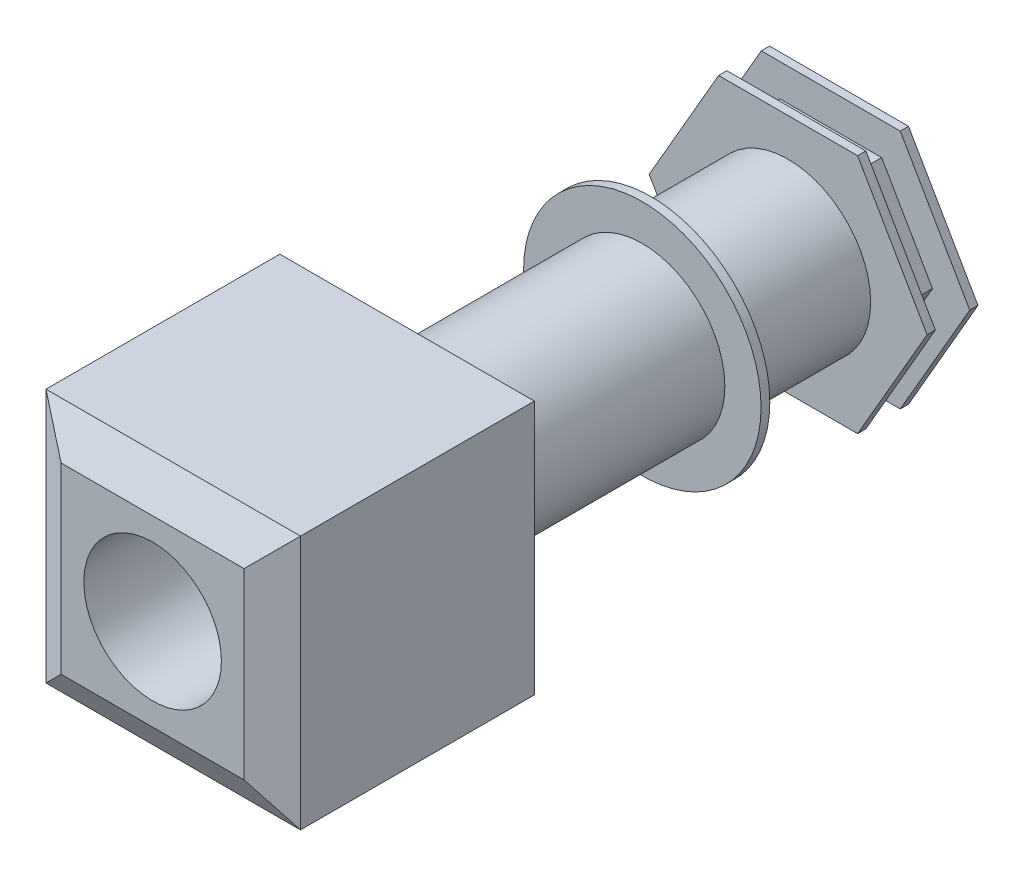
ISO-10303-21;
HEADER;
FILE_DESCRIPTION(('STEP AP214'),'2;1');
FILE_NAME('part.step','',(''),(''),'','','');
FILE_SCHEMA(('AUTOMOTIVE_DESIGN { 1 0 10303 214 1 1 1 1 }'));
ENDSEC;
DATA;
#1=APPLICATION_CONTEXT('core data for automotive mechanical design processes');
#2=APPLICATION_PROTOCOL_DEFINITION('international standard','automotive_design',2000,#1);
#3=PRODUCT_CONTEXT('',#1,'mechanical');
#4=PRODUCT('Part','Part','',(#3));
#5=PRODUCT_RELATED_PRODUCT_CATEGORY('part','',(#4));
#6=PRODUCT_DEFINITION_FORMATION('','',#4);
#7=PRODUCT_DEFINITION_CONTEXT('part definition',#1,'design');
#8=PRODUCT_DEFINITION('design','',#6,#7);
#9=PRODUCT_DEFINITION_SHAPE('','',#8);
#10=(LENGTH_UNIT() NAMED_UNIT(*) SI_UNIT(.MILLI.,.METRE.));
#11=(NAMED_UNIT(*) PLANE_ANGLE_UNIT() SI_UNIT($,.RADIAN.));
#12=(NAMED_UNIT(*) SI_UNIT($,.STERADIAN.) SOLID_ANGLE_UNIT());
#13=UNCERTAINTY_MEASURE_WITH_UNIT(LENGTH_MEASURE(1.E-05),#10,'distance_accuracy_value','');
#14=(GEOMETRIC_REPRESENTATION_CONTEXT(3) GLOBAL_UNCERTAINTY_ASSIGNED_CONTEXT((#13)) GLOBAL_UNIT_ASSIGNED_CONTEXT((#10,
#11,#12)) REPRESENTATION_CONTEXT('',''));
#15=CARTESIAN_POINT('',(0.,0.,0.));
#16=DIRECTION('',(0.,0.,1.));
#17=DIRECTION('',(1.,0.,0.));
#18=AXIS2_PLACEMENT_3D('',#15,#16,#17);
#19=CARTESIAN_POINT('',(101.036297108185,-175.,12.));
#20=DIRECTION('',(-0.866025403784439,0.5,0.));
#21=DIRECTION('',(-0.5,-0.866025403784439,0.));
#22=AXIS2_PLACEMENT_3D('',#19,#20,#21);
#23=PLANE('',#22);
#24=DIRECTION('',(0.5,0.866025403784439,0.));
#25=VECTOR('',#24,1.);
#26=CARTESIAN_POINT('',(101.036297108185,-175.,0.));
#27=LINE('',#26,#25);
#28=CARTESIAN_POINT('',(101.036297108185,-175.,0.));
#29=VERTEX_POINT('',#28);
#30=CARTESIAN_POINT('',(202.072594216369,0.,0.));
#31=VERTEX_POINT('',#30);
#32=EDGE_CURVE('E409',#29,#31,#27,.T.);
#33=ORIENTED_EDGE('',*,*,#32,.T.);
#34=DIRECTION('',(0.,0.,-1.));
#35=VECTOR('',#34,1.);
#36=CARTESIAN_POINT('',(202.072594216369,0.,12.));
#37=LINE('',#36,#35);
#38=CARTESIAN_POINT('',(202.072594216369,0.,12.));
#39=VERTEX_POINT('',#38);
#40=EDGE_CURVE('E275',#39,#31,#37,.T.);
#41=ORIENTED_EDGE('',*,*,#40,.F.);
#42=DIRECTION('',(0.5,0.866025403784439,0.));
#43=VECTOR('',#42,1.);
#44=CARTESIAN_POINT('',(101.036297108185,-175.,12.));
#45=LINE('',#44,#43);
#46=CARTESIAN_POINT('',(101.036297108185,-175.,12.));
#47=VERTEX_POINT('',#46);
#48=EDGE_CURVE('E410',#47,#39,#45,.T.);
#49=ORIENTED_EDGE('',*,*,#48,.F.);
#50=DIRECTION('',(0.,0.,-1.));
#51=VECTOR('',#50,1.);
#52=CARTESIAN_POINT('',(101.036297108185,-175.,12.));
#53=LINE('',#52,#51);
#54=EDGE_CURVE('E430',#47,#29,#53,.T.);
#55=ORIENTED_EDGE('',*,*,#54,.T.);
#56=EDGE_LOOP('',(#33,#41,#49,#55));
#57=FACE_BOUND('',#56,.T.);
#58=ADVANCED_FACE('F41',(#57),#23,.F.);
#59=CARTESIAN_POINT('',(202.072594216369,0.,12.));
#60=DIRECTION('',(-0.866025403784439,-0.5,0.));
#61=DIRECTION('',(0.5,-0.866025403784439,0.));
#62=AXIS2_PLACEMENT_3D('',#59,#60,#61);
#63=PLANE('',#62);
#64=DIRECTION('',(-0.5,0.866025403784439,0.));
#65=VECTOR('',#64,1.);
#66=CARTESIAN_POINT('',(202.072594216369,0.,0.));
#67=LINE('',#66,#65);
#68=CARTESIAN_POINT('',(101.036297108185,175.,0.));
#69=VERTEX_POINT('',#68);
#70=EDGE_CURVE('E434',#31,#69,#67,.T.);
#71=ORIENTED_EDGE('',*,*,#70,.T.);
#72=DIRECTION('',(0.,0.,-1.));
#73=VECTOR('',#72,1.);
#74=CARTESIAN_POINT('',(101.036297108185,175.,12.));
#75=LINE('',#74,#73);
#76=CARTESIAN_POINT('',(101.036297108185,175.,12.));
#77=VERTEX_POINT('',#76);
#78=EDGE_CURVE('E463',#77,#69,#75,.T.);
#79=ORIENTED_EDGE('',*,*,#78,.F.);
#80=DIRECTION('',(-0.5,0.866025403784439,0.));
#81=VECTOR('',#80,1.);
#82=CARTESIAN_POINT('',(202.072594216369,0.,12.));
#83=LINE('',#82,#81);
#84=EDGE_CURVE('E414',#39,#77,#83,.T.);
#85=ORIENTED_EDGE('',*,*,#84,.F.);
#86=ORIENTED_EDGE('',*,*,#40,.T.);
#87=EDGE_LOOP('',(#71,#79,#85,#86));
#88=FACE_BOUND('',#87,.T.);
#89=ADVANCED_FACE('F540',(#88),#63,.F.);
#90=CARTESIAN_POINT('',(101.036297108185,175.,12.));
#91=DIRECTION('',(0.,-1.,0.));
#92=DIRECTION('',(1.,0.,0.));
#93=AXIS2_PLACEMENT_3D('',#90,#91,#92);
#94=PLANE('',#93);
#95=DIRECTION('',(-1.,0.,0.));
#96=VECTOR('',#95,1.);
#97=CARTESIAN_POINT('',(101.036297108185,175.,0.));
#98=LINE('',#97,#96);
#99=CARTESIAN_POINT('',(-101.036297108185,175.,0.));
#100=VERTEX_POINT('',#99);
#101=EDGE_CURVE('E437',#69,#100,#98,.T.);
#102=ORIENTED_EDGE('',*,*,#101,.T.);
#103=DIRECTION('',(0.,0.,-1.));
#104=VECTOR('',#103,1.);
#105=CARTESIAN_POINT('',(-101.036297108185,175.,12.));
#106=LINE('',#105,#104);
#107=CARTESIAN_POINT('',(-101.036297108185,175.,12.));
#108=VERTEX_POINT('',#107);
#109=EDGE_CURVE('E459',#108,#100,#106,.T.);
#110=ORIENTED_EDGE('',*,*,#109,.F.);
#111=DIRECTION('',(-1.,0.,0.));
#112=VECTOR('',#111,1.);
#113=CARTESIAN_POINT('',(101.036297108185,175.,12.));
#114=LINE('',#113,#112);
#115=EDGE_CURVE('E418',#77,#108,#114,.T.);
#116=ORIENTED_EDGE('',*,*,#115,.F.);
#117=ORIENTED_EDGE('',*,*,#78,.T.);
#118=EDGE_LOOP('',(#102,#110,#116,#117));
#119=FACE_BOUND('',#118,.T.);
#120=ADVANCED_FACE('F546',(#119),#94,.F.);
#121=CARTESIAN_POINT('',(-101.036297108185,175.,12.));
#122=DIRECTION('',(0.866025403784439,-0.5,0.));
#123=DIRECTION('',(0.5,0.866025403784439,0.));
#124=AXIS2_PLACEMENT_3D('',#121,#122,#123);
#125=PLANE('',#124);
#126=DIRECTION('',(-0.5,-0.866025403784439,0.));
#127=VECTOR('',#126,1.);
#128=CARTESIAN_POINT('',(-101.036297108185,175.,0.));
#129=LINE('',#128,#127);
#130=CARTESIAN_POINT('',(-202.072594216369,0.,0.));
#131=VERTEX_POINT('',#130);
#132=EDGE_CURVE('E440',#100,#131,#129,.T.);
#133=ORIENTED_EDGE('',*,*,#132,.T.);
#134=DIRECTION('',(0.,0.,-1.));
#135=VECTOR('',#134,1.);
#136=CARTESIAN_POINT('',(-202.072594216369,0.,12.));
#137=LINE('',#136,#135);
#138=CARTESIAN_POINT('',(-202.072594216369,0.,12.));
#139=VERTEX_POINT('',#138);
#140=EDGE_CURVE('E455',#139,#131,#137,.T.);
#141=ORIENTED_EDGE('',*,*,#140,.F.);
#142=DIRECTION('',(-0.5,-0.866025403784439,0.));
#143=VECTOR('',#142,1.);
#144=CARTESIAN_POINT('',(-101.036297108185,175.,12.));
#145=LINE('',#144,#143);
#146=EDGE_CURVE('E421',#108,#139,#145,.T.);
#147=ORIENTED_EDGE('',*,*,#146,.F.);
#148=ORIENTED_EDGE('',*,*,#109,.T.);
#149=EDGE_LOOP('',(#133,#141,#147,#148));
#150=FACE_BOUND('',#149,.T.);
#151=ADVANCED_FACE('F700',(#150),#125,.F.);
#152=CARTESIAN_POINT('',(-202.072594216369,0.,12.));
#153=DIRECTION('',(0.866025403784439,0.5,0.));
#154=DIRECTION('',(-0.5,0.866025403784439,0.));
#155=AXIS2_PLACEMENT_3D('',#152,#153,#154);
#156=PLANE('',#155);
#157=DIRECTION('',(0.5,-0.866025403784439,0.));
#158=VECTOR('',#157,1.);
#159=CARTESIAN_POINT('',(-202.072594216369,0.,0.));
#160=LINE('',#159,#158);
#161=CARTESIAN_POINT('',(-101.036297108185,-175.,0.));
#162=VERTEX_POINT('',#161);
#163=EDGE_CURVE('E443',#131,#162,#160,.T.);
#164=ORIENTED_EDGE('',*,*,#163,.T.);
#165=DIRECTION('',(0.,0.,-1.));
#166=VECTOR('',#165,1.);
#167=CARTESIAN_POINT('',(-101.036297108185,-175.,12.));
#168=LINE('',#167,#166);
#169=CARTESIAN_POINT('',(-101.036297108185,-175.,12.));
#170=VERTEX_POINT('',#169);
#171=EDGE_CURVE('E451',#170,#162,#168,.T.);
#172=ORIENTED_EDGE('',*,*,#171,.F.);
#173=DIRECTION('',(0.5,-0.866025403784439,0.));
#174=VECTOR('',#173,1.);
#175=CARTESIAN_POINT('',(-202.072594216369,0.,12.));
#176=LINE('',#175,#174);
#177=EDGE_CURVE('E424',#139,#170,#176,.T.);
#178=ORIENTED_EDGE('',*,*,#177,.F.);
#179=ORIENTED_EDGE('',*,*,#140,.T.);
#180=EDGE_LOOP('',(#164,#172,#178,#179));
#181=FACE_BOUND('',#180,.T.);
#182=ADVANCED_FACE('F696',(#181),#156,.F.);
#183=CARTESIAN_POINT('',(-101.036297108185,-175.,12.));
#184=DIRECTION('',(0.,1.,0.));
#185=DIRECTION('',(0.,0.,1.));
#186=AXIS2_PLACEMENT_3D('',#183,#184,#185);
#187=PLANE('',#186);
#188=DIRECTION('',(1.,0.,0.));
#189=VECTOR('',#188,1.);
#190=CARTESIAN_POINT('',(-101.036297108185,-175.,0.));
#191=LINE('',#190,#189);
#192=EDGE_CURVE('E415',#162,#29,#191,.T.);
#193=ORIENTED_EDGE('',*,*,#192,.T.);
#194=ORIENTED_EDGE('',*,*,#54,.F.);
#195=DIRECTION('',(1.,0.,0.));
#196=VECTOR('',#195,1.);
#197=CARTESIAN_POINT('',(-101.036297108185,-175.,12.));
#198=LINE('',#197,#196);
#199=EDGE_CURVE('E427',#170,#47,#198,.T.);
#200=ORIENTED_EDGE('',*,*,#199,.F.);
#201=ORIENTED_EDGE('',*,*,#171,.T.);
#202=EDGE_LOOP('',(#193,#194,#200,#201));
#203=FACE_BOUND('',#202,.T.);
#204=ADVANCED_FACE('F689',(#203),#187,.F.);
#205=CARTESIAN_POINT('',(0.,0.,12.));
#206=DIRECTION('',(0.,0.,1.));
#207=DIRECTION('',(1.,0.,0.));
#208=AXIS2_PLACEMENT_3D('',#205,#206,#207);
#209=PLANE('',#208);
#210=DIRECTION('',(0.499999999999995,0.866025403784441,0.));
#211=VECTOR('',#210,1.);
#212=CARTESIAN_POINT('',(73.9437494106932,-128.074330881458,12.));
#213=LINE('',#212,#211);
#214=CARTESIAN_POINT('',(73.9437494106932,-128.074330881458,12.));
#215=VERTEX_POINT('',#214);
#216=CARTESIAN_POINT('',(147.887498821383,0.,12.));
#217=VERTEX_POINT('',#216);
#218=EDGE_CURVE('E337',#215,#217,#213,.T.);
#219=ORIENTED_EDGE('',*,*,#218,.F.);
#220=DIRECTION('',(1.,0.,0.));
#221=VECTOR('',#220,1.);
#222=CARTESIAN_POINT('',(-73.9437494106905,-128.07433088146,12.));
#223=LINE('',#222,#221);
#224=CARTESIAN_POINT('',(-73.9437494106905,-128.07433088146,12.));
#225=VERTEX_POINT('',#224);
#226=EDGE_CURVE('E343',#225,#215,#223,.T.);
#227=ORIENTED_EDGE('',*,*,#226,.F.);
#228=DIRECTION('',(0.500000000000007,-0.866025403784435,0.));
#229=VECTOR('',#228,1.);
#230=CARTESIAN_POINT('',(-147.887498821383,-1.03269288476609E-12,12.));
#231=LINE('',#230,#229);
#232=CARTESIAN_POINT('',(-147.887498821383,-1.03269288476609E-12,12.));
#233=VERTEX_POINT('',#232);
#234=EDGE_CURVE('E379',#233,#225,#231,.T.);
#235=ORIENTED_EDGE('',*,*,#234,.F.);
#236=DIRECTION('',(-0.499999999999995,-0.866025403784442,0.));
#237=VECTOR('',#236,1.);
#238=CARTESIAN_POINT('',(-73.9437494106923,128.074330881459,12.));
#239=LINE('',#238,#237);
#240=CARTESIAN_POINT('',(-73.9437494106923,128.074330881459,12.));
#241=VERTEX_POINT('',#240);
#242=EDGE_CURVE('E375',#241,#233,#239,.T.);
#243=ORIENTED_EDGE('',*,*,#242,.F.);
#244=DIRECTION('',(-1.,0.,0.));
#245=VECTOR('',#244,1.);
#246=CARTESIAN_POINT('',(73.9437494106914,128.074330881459,12.));
#247=LINE('',#246,#245);
#248=CARTESIAN_POINT('',(73.9437494106914,128.074330881459,12.));
#249=VERTEX_POINT('',#248);
#250=EDGE_CURVE('E371',#249,#241,#247,.T.);
#251=ORIENTED_EDGE('',*,*,#250,.F.);
#252=DIRECTION('',(-0.500000000000001,0.866025403784438,0.));
#253=VECTOR('',#252,1.);
#254=CARTESIAN_POINT('',(147.887498821383,0.,12.));
#255=LINE('',#254,#253);
#256=EDGE_CURVE('E367',#217,#249,#255,.T.);
#257=ORIENTED_EDGE('',*,*,#256,.F.);
#258=EDGE_LOOP('',(#219,#227,#235,#243,#251,#257));
#259=FACE_BOUND('',#258,.T.);
#260=ORIENTED_EDGE('',*,*,#48,.T.);
#261=ORIENTED_EDGE('',*,*,#84,.T.);
#262=ORIENTED_EDGE('',*,*,#115,.T.);
#263=ORIENTED_EDGE('',*,*,#146,.T.);
#264=ORIENTED_EDGE('',*,*,#177,.T.);
#265=ORIENTED_EDGE('',*,*,#199,.T.);
#266=EDGE_LOOP('',(#260,#261,#262,#263,#264,#265));
#267=FACE_BOUND('',#266,.T.);
#268=ADVANCED_FACE('F686',(#259,#267),#209,.T.);
#269=CARTESIAN_POINT('',(0.,0.,0.));
#270=DIRECTION('',(0.,0.,1.));
#271=DIRECTION('',(1.,0.,0.));
#272=AXIS2_PLACEMENT_3D('',#269,#270,#271);
#273=PLANE('',#272);
#274=ORIENTED_EDGE('',*,*,#32,.F.);
#275=ORIENTED_EDGE('',*,*,#192,.F.);
#276=ORIENTED_EDGE('',*,*,#163,.F.);
#277=ORIENTED_EDGE('',*,*,#132,.F.);
#278=ORIENTED_EDGE('',*,*,#101,.F.);
#279=ORIENTED_EDGE('',*,*,#70,.F.);
#280=EDGE_LOOP('',(#274,#275,#276,#277,#278,#279));
#281=FACE_BOUND('',#280,.T.);
#282=ADVANCED_FACE('F684',(#281),#273,.F.);
#283=CARTESIAN_POINT('',(73.9437494106932,-128.074330881458,62.));
#284=DIRECTION('',(-0.866025403784442,0.499999999999995,0.));
#285=DIRECTION('',(-0.499999999999995,-0.866025403784442,0.));
#286=AXIS2_PLACEMENT_3D('',#283,#284,#285);
#287=PLANE('',#286);
#288=ORIENTED_EDGE('',*,*,#218,.T.);
#289=DIRECTION('',(0.,0.,-1.));
#290=VECTOR('',#289,1.);
#291=CARTESIAN_POINT('',(147.887498821383,0.,62.));
#292=LINE('',#291,#290);
#293=CARTESIAN_POINT('',(147.887498821383,0.,62.));
#294=VERTEX_POINT('',#293);
#295=EDGE_CURVE('E405',#294,#217,#292,.T.);
#296=ORIENTED_EDGE('',*,*,#295,.F.);
#297=DIRECTION('',(0.499999999999995,0.866025403784441,0.));
#298=VECTOR('',#297,1.);
#299=CARTESIAN_POINT('',(73.9437494106932,-128.074330881458,62.));
#300=LINE('',#299,#298);
#301=CARTESIAN_POINT('',(73.9437494106932,-128.074330881458,62.));
#302=VERTEX_POINT('',#301);
#303=EDGE_CURVE('E338',#302,#294,#300,.T.);
#304=ORIENTED_EDGE('',*,*,#303,.F.);
#305=DIRECTION('',(0.,0.,-1.));
#306=VECTOR('',#305,1.);
#307=CARTESIAN_POINT('',(73.9437494106932,-128.074330881458,62.));
#308=LINE('',#307,#306);
#309=EDGE_CURVE('E363',#302,#215,#308,.T.);
#310=ORIENTED_EDGE('',*,*,#309,.T.);
#311=EDGE_LOOP('',(#288,#296,#304,#310));
#312=FACE_BOUND('',#311,.T.);
#313=ADVANCED_FACE('F680',(#312),#287,.F.);
#314=CARTESIAN_POINT('',(147.887498821383,0.,62.));
#315=DIRECTION('',(-0.866025403784438,-0.500000000000001,0.));
#316=DIRECTION('',(0.500000000000001,-0.866025403784438,0.));
#317=AXIS2_PLACEMENT_3D('',#314,#315,#316);
#318=PLANE('',#317);
#319=ORIENTED_EDGE('',*,*,#256,.T.);
#320=DIRECTION('',(0.,0.,-1.));
#321=VECTOR('',#320,1.);
#322=CARTESIAN_POINT('',(73.9437494106914,128.074330881459,62.));
#323=LINE('',#322,#321);
#324=CARTESIAN_POINT('',(73.9437494106914,128.074330881459,62.));
#325=VERTEX_POINT('',#324);
#326=EDGE_CURVE('E401',#325,#249,#323,.T.);
#327=ORIENTED_EDGE('',*,*,#326,.F.);
#328=DIRECTION('',(-0.500000000000001,0.866025403784438,0.));
#329=VECTOR('',#328,1.);
#330=CARTESIAN_POINT('',(147.887498821383,0.,62.));
#331=LINE('',#330,#329);
#332=EDGE_CURVE('E342',#294,#325,#331,.T.);
#333=ORIENTED_EDGE('',*,*,#332,.F.);
#334=ORIENTED_EDGE('',*,*,#295,.T.);
#335=EDGE_LOOP('',(#319,#327,#333,#334));
#336=FACE_BOUND('',#335,.T.);
#337=ADVANCED_FACE('F676',(#336),#318,.F.);
#338=CARTESIAN_POINT('',(73.9437494106914,128.074330881459,62.));
#339=DIRECTION('',(0.,-1.,0.));
#340=DIRECTION('',(1.,0.,0.));
#341=AXIS2_PLACEMENT_3D('',#338,#339,#340);
#342=PLANE('',#341);
#343=ORIENTED_EDGE('',*,*,#250,.T.);
#344=DIRECTION('',(0.,0.,-1.));
#345=VECTOR('',#344,1.);
#346=CARTESIAN_POINT('',(-73.9437494106923,128.074330881459,62.));
#347=LINE('',#346,#345);
#348=CARTESIAN_POINT('',(-73.9437494106923,128.074330881459,62.));
#349=VERTEX_POINT('',#348);
#350=EDGE_CURVE('E397',#349,#241,#347,.T.);
#351=ORIENTED_EDGE('',*,*,#350,.F.);
#352=DIRECTION('',(-1.,0.,0.));
#353=VECTOR('',#352,1.);
#354=CARTESIAN_POINT('',(73.9437494106914,128.074330881459,62.));
#355=LINE('',#354,#353);
#356=EDGE_CURVE('E347',#325,#349,#355,.T.);
#357=ORIENTED_EDGE('',*,*,#356,.F.);
#358=ORIENTED_EDGE('',*,*,#326,.T.);
#359=EDGE_LOOP('',(#343,#351,#357,#358));
#360=FACE_BOUND('',#359,.T.);
#361=ADVANCED_FACE('F672',(#360),#342,.F.);
#362=CARTESIAN_POINT('',(-73.9437494106923,128.074330881459,62.));
#363=DIRECTION('',(0.866025403784442,-0.499999999999995,0.));
#364=DIRECTION('',(0.499999999999995,0.866025403784442,0.));
#365=AXIS2_PLACEMENT_3D('',#362,#363,#364);
#366=PLANE('',#365);
#367=ORIENTED_EDGE('',*,*,#242,.T.);
#368=DIRECTION('',(0.,0.,-1.));
#369=VECTOR('',#368,1.);
#370=CARTESIAN_POINT('',(-147.887498821383,-1.03269288476609E-12,62.));
#371=LINE('',#370,#369);
#372=CARTESIAN_POINT('',(-147.887498821383,-1.03269288476609E-12,62.));
#373=VERTEX_POINT('',#372);
#374=EDGE_CURVE('E393',#373,#233,#371,.T.);
#375=ORIENTED_EDGE('',*,*,#374,.F.);
#376=DIRECTION('',(-0.499999999999995,-0.866025403784442,0.));
#377=VECTOR('',#376,1.);
#378=CARTESIAN_POINT('',(-73.9437494106923,128.074330881459,62.));
#379=LINE('',#378,#377);
#380=EDGE_CURVE('E351',#349,#373,#379,.T.);
#381=ORIENTED_EDGE('',*,*,#380,.F.);
#382=ORIENTED_EDGE('',*,*,#350,.T.);
#383=EDGE_LOOP('',(#367,#375,#381,#382));
#384=FACE_BOUND('',#383,.T.);
#385=ADVANCED_FACE('F668',(#384),#366,.F.);
#386=CARTESIAN_POINT('',(-147.887498821383,-1.03269288476609E-12,62.));
#387=DIRECTION('',(0.866025403784435,0.500000000000007,0.));
#388=DIRECTION('',(-0.500000000000007,0.866025403784435,0.));
#389=AXIS2_PLACEMENT_3D('',#386,#387,#388);
#390=PLANE('',#389);
#391=ORIENTED_EDGE('',*,*,#234,.T.);
#392=DIRECTION('',(0.,0.,-1.));
#393=VECTOR('',#392,1.);
#394=CARTESIAN_POINT('',(-73.9437494106905,-128.07433088146,62.));
#395=LINE('',#394,#393);
#396=CARTESIAN_POINT('',(-73.9437494106905,-128.07433088146,62.));
#397=VERTEX_POINT('',#396);
#398=EDGE_CURVE('E389',#397,#225,#395,.T.);
#399=ORIENTED_EDGE('',*,*,#398,.F.);
#400=DIRECTION('',(0.500000000000007,-0.866025403784435,0.));
#401=VECTOR('',#400,1.);
#402=CARTESIAN_POINT('',(-147.887498821383,-1.03269288476609E-12,62.));
#403=LINE('',#402,#401);
#404=EDGE_CURVE('E355',#373,#397,#403,.T.);
#405=ORIENTED_EDGE('',*,*,#404,.F.);
#406=ORIENTED_EDGE('',*,*,#374,.T.);
#407=EDGE_LOOP('',(#391,#399,#405,#406));
#408=FACE_BOUND('',#407,.T.);
#409=ADVANCED_FACE('F664',(#408),#390,.F.);
#410=CARTESIAN_POINT('',(-73.9437494106905,-128.07433088146,62.));
#411=DIRECTION('',(0.,1.,0.));
#412=DIRECTION('',(-1.,0.,0.));
#413=AXIS2_PLACEMENT_3D('',#410,#411,#412);
#414=PLANE('',#413);
#415=ORIENTED_EDGE('',*,*,#226,.T.);
#416=ORIENTED_EDGE('',*,*,#309,.F.);
#417=DIRECTION('',(1.,0.,0.));
#418=VECTOR('',#417,1.);
#419=CARTESIAN_POINT('',(-73.9437494106905,-128.07433088146,62.));
#420=LINE('',#419,#418);
#421=EDGE_CURVE('E359',#397,#302,#420,.T.);
#422=ORIENTED_EDGE('',*,*,#421,.F.);
#423=ORIENTED_EDGE('',*,*,#398,.T.);
#424=EDGE_LOOP('',(#415,#416,#422,#423));
#425=FACE_BOUND('',#424,.T.);
#426=ADVANCED_FACE('F638',(#425),#414,.F.);
#427=CARTESIAN_POINT('',(0.,0.,62.));
#428=DIRECTION('',(0.,0.,1.));
#429=DIRECTION('',(1.,0.,0.));
#430=AXIS2_PLACEMENT_3D('',#427,#428,#429);
#431=PLANE('',#430);
#432=DIRECTION('',(0.499999999999995,0.866025403784442,0.));
#433=VECTOR('',#432,1.);
#434=CARTESIAN_POINT('',(101.036297108187,-174.999999999999,62.));
#435=LINE('',#434,#433);
#436=CARTESIAN_POINT('',(101.036297108187,-174.999999999999,62.));
#437=VERTEX_POINT('',#436);
#438=CARTESIAN_POINT('',(202.072594216369,0.,62.));
#439=VERTEX_POINT('',#438);
#440=EDGE_CURVE('E269',#437,#439,#435,.T.);
#441=ORIENTED_EDGE('',*,*,#440,.F.);
#442=DIRECTION('',(1.,0.,0.));
#443=VECTOR('',#442,1.);
#444=CARTESIAN_POINT('',(-101.036297108183,-175.000000000001,62.));
#445=LINE('',#444,#443);
#446=CARTESIAN_POINT('',(-101.036297108183,-175.000000000001,62.));
#447=VERTEX_POINT('',#446);
#448=EDGE_CURVE('E281',#447,#437,#445,.T.);
#449=ORIENTED_EDGE('',*,*,#448,.F.);
#450=DIRECTION('',(0.500000000000007,-0.866025403784435,0.));
#451=VECTOR('',#450,1.);
#452=CARTESIAN_POINT('',(-202.072594216369,-1.41106538359615E-12,62.));
#453=LINE('',#452,#451);
#454=CARTESIAN_POINT('',(-202.072594216369,-1.41106538359615E-12,62.));
#455=VERTEX_POINT('',#454);
#456=EDGE_CURVE('E309',#455,#447,#453,.T.);
#457=ORIENTED_EDGE('',*,*,#456,.F.);
#458=DIRECTION('',(-0.499999999999995,-0.866025403784442,0.));
#459=VECTOR('',#458,1.);
#460=CARTESIAN_POINT('',(-101.036297108185,175.,62.));
#461=LINE('',#460,#459);
#462=CARTESIAN_POINT('',(-101.036297108185,175.,62.));
#463=VERTEX_POINT('',#462);
#464=EDGE_CURVE('E306',#463,#455,#461,.T.);
#465=ORIENTED_EDGE('',*,*,#464,.F.);
#466=DIRECTION('',(-1.,0.,0.));
#467=VECTOR('',#466,1.);
#468=CARTESIAN_POINT('',(101.036297108184,175.,62.));
#469=LINE('',#468,#467);
#470=CARTESIAN_POINT('',(101.036297108184,175.,62.));
#471=VERTEX_POINT('',#470);
#472=EDGE_CURVE('E303',#471,#463,#469,.T.);
#473=ORIENTED_EDGE('',*,*,#472,.F.);
#474=DIRECTION('',(-0.500000000000001,0.866025403784438,0.));
#475=VECTOR('',#474,1.);
#476=CARTESIAN_POINT('',(202.072594216369,0.,62.));
#477=LINE('',#476,#475);
#478=EDGE_CURVE('E300',#439,#471,#477,.T.);
#479=ORIENTED_EDGE('',*,*,#478,.F.);
#480=EDGE_LOOP('',(#441,#449,#457,#465,#473,#479));
#481=FACE_BOUND('',#480,.T.);
#482=ORIENTED_EDGE('',*,*,#421,.T.);
#483=ORIENTED_EDGE('',*,*,#303,.T.);
#484=ORIENTED_EDGE('',*,*,#332,.T.);
#485=ORIENTED_EDGE('',*,*,#356,.T.);
#486=ORIENTED_EDGE('',*,*,#380,.T.);
#487=ORIENTED_EDGE('',*,*,#404,.T.);
#488=EDGE_LOOP('',(#482,#483,#484,#485,#486,#487));
#489=FACE_BOUND('',#488,.T.);
#490=ADVANCED_FACE('F634',(#481,#489),#431,.F.);
#491=CARTESIAN_POINT('',(101.036297108187,-174.999999999999,74.));
#492=DIRECTION('',(-0.866025403784441,0.499999999999995,0.));
#493=DIRECTION('',(-0.499999999999995,-0.866025403784442,0.));
#494=AXIS2_PLACEMENT_3D('',#491,#492,#493);
#495=PLANE('',#494);
#496=ORIENTED_EDGE('',*,*,#440,.T.);
#497=DIRECTION('',(0.,0.,-1.));
#498=VECTOR('',#497,1.);
#499=CARTESIAN_POINT('',(202.072594216369,0.,74.));
#500=LINE('',#499,#498);
#501=CARTESIAN_POINT('',(202.072594216369,0.,74.));
#502=VERTEX_POINT('',#501);
#503=EDGE_CURVE('E333',#502,#439,#500,.T.);
#504=ORIENTED_EDGE('',*,*,#503,.F.);
#505=DIRECTION('',(0.499999999999995,0.866025403784442,0.));
#506=VECTOR('',#505,1.);
#507=CARTESIAN_POINT('',(101.036297108187,-174.999999999999,74.));
#508=LINE('',#507,#506);
#509=CARTESIAN_POINT('',(101.036297108187,-174.999999999999,74.));
#510=VERTEX_POINT('',#509);
#511=EDGE_CURVE('E276',#510,#502,#508,.T.);
#512=ORIENTED_EDGE('',*,*,#511,.F.);
#513=DIRECTION('',(0.,0.,-1.));
#514=VECTOR('',#513,1.);
#515=CARTESIAN_POINT('',(101.036297108187,-174.999999999999,74.));
#516=LINE('',#515,#514);
#517=EDGE_CURVE('E296',#510,#437,#516,.T.);
#518=ORIENTED_EDGE('',*,*,#517,.T.);
#519=EDGE_LOOP('',(#496,#504,#512,#518));
#520=FACE_BOUND('',#519,.T.);
#521=ADVANCED_FACE('F637',(#520),#495,.F.);
#522=CARTESIAN_POINT('',(202.072594216369,0.,74.));
#523=DIRECTION('',(-0.866025403784438,-0.500000000000001,0.));
#524=DIRECTION('',(0.500000000000001,-0.866025403784438,0.));
#525=AXIS2_PLACEMENT_3D('',#522,#523,#524);
#526=PLANE('',#525);
#527=ORIENTED_EDGE('',*,*,#478,.T.);
#528=DIRECTION('',(0.,0.,-1.));
#529=VECTOR('',#528,1.);
#530=CARTESIAN_POINT('',(101.036297108184,175.,74.));
#531=LINE('',#530,#529);
#532=CARTESIAN_POINT('',(101.036297108184,175.,74.));
#533=VERTEX_POINT('',#532);
#534=EDGE_CURVE('E329',#533,#471,#531,.T.);
#535=ORIENTED_EDGE('',*,*,#534,.F.);
#536=DIRECTION('',(-0.500000000000001,0.866025403784438,0.));
#537=VECTOR('',#536,1.);
#538=CARTESIAN_POINT('',(202.072594216369,0.,74.));
#539=LINE('',#538,#537);
#540=EDGE_CURVE('E280',#502,#533,#539,.T.);
#541=ORIENTED_EDGE('',*,*,#540,.F.);
#542=ORIENTED_EDGE('',*,*,#503,.T.);
#543=EDGE_LOOP('',(#527,#535,#541,#542));
#544=FACE_BOUND('',#543,.T.);
#545=ADVANCED_FACE('F654',(#544),#526,.F.);
#546=CARTESIAN_POINT('',(101.036297108184,175.,74.));
#547=DIRECTION('',(0.,-1.,0.));
#548=DIRECTION('',(1.,0.,0.));
#549=AXIS2_PLACEMENT_3D('',#546,#547,#548);
#550=PLANE('',#549);
#551=ORIENTED_EDGE('',*,*,#472,.T.);
#552=DIRECTION('',(0.,0.,-1.));
#553=VECTOR('',#552,1.);
#554=CARTESIAN_POINT('',(-101.036297108185,175.,74.));
#555=LINE('',#554,#553);
#556=CARTESIAN_POINT('',(-101.036297108185,175.,74.));
#557=VERTEX_POINT('',#556);
#558=EDGE_CURVE('E325',#557,#463,#555,.T.);
#559=ORIENTED_EDGE('',*,*,#558,.F.);
#560=DIRECTION('',(-1.,0.,0.));
#561=VECTOR('',#560,1.);
#562=CARTESIAN_POINT('',(101.036297108184,175.,74.));
#563=LINE('',#562,#561);
#564=EDGE_CURVE('E284',#533,#557,#563,.T.);
#565=ORIENTED_EDGE('',*,*,#564,.F.);
#566=ORIENTED_EDGE('',*,*,#534,.T.);
#567=EDGE_LOOP('',(#551,#559,#565,#566));
#568=FACE_BOUND('',#567,.T.);
#569=ADVANCED_FACE('F650',(#568),#550,.F.);
#570=CARTESIAN_POINT('',(-101.036297108185,175.,74.));
#571=DIRECTION('',(0.866025403784441,-0.499999999999995,0.));
#572=DIRECTION('',(0.499999999999995,0.866025403784442,0.));
#573=AXIS2_PLACEMENT_3D('',#570,#571,#572);
#574=PLANE('',#573);
#575=ORIENTED_EDGE('',*,*,#464,.T.);
#576=DIRECTION('',(0.,0.,-1.));
#577=VECTOR('',#576,1.);
#578=CARTESIAN_POINT('',(-202.072594216369,-1.41106538359615E-12,74.));
#579=LINE('',#578,#577);
#580=CARTESIAN_POINT('',(-202.072594216369,-1.41106538359615E-12,74.));
#581=VERTEX_POINT('',#580);
#582=EDGE_CURVE('E321',#581,#455,#579,.T.);
#583=ORIENTED_EDGE('',*,*,#582,.F.);
#584=DIRECTION('',(-0.499999999999995,-0.866025403784442,0.));
#585=VECTOR('',#584,1.);
#586=CARTESIAN_POINT('',(-101.036297108185,175.,74.));
#587=LINE('',#586,#585);
#588=EDGE_CURVE('E287',#557,#581,#587,.T.);
#589=ORIENTED_EDGE('',*,*,#588,.F.);
#590=ORIENTED_EDGE('',*,*,#558,.T.);
#591=EDGE_LOOP('',(#575,#583,#589,#590));
#592=FACE_BOUND('',#591,.T.);
#593=ADVANCED_FACE('F646',(#592),#574,.F.);
#594=CARTESIAN_POINT('',(-202.072594216369,-1.41106538359615E-12,74.));
#595=DIRECTION('',(0.866025403784435,0.500000000000007,0.));
#596=DIRECTION('',(-0.500000000000007,0.866025403784434,0.));
#597=AXIS2_PLACEMENT_3D('',#594,#595,#596);
#598=PLANE('',#597);
#599=ORIENTED_EDGE('',*,*,#456,.T.);
#600=DIRECTION('',(0.,0.,-1.));
#601=VECTOR('',#600,1.);
#602=CARTESIAN_POINT('',(-101.036297108183,-175.000000000001,74.));
#603=LINE('',#602,#601);
#604=CARTESIAN_POINT('',(-101.036297108183,-175.000000000001,74.));
#605=VERTEX_POINT('',#604);
#606=EDGE_CURVE('E317',#605,#447,#603,.T.);
#607=ORIENTED_EDGE('',*,*,#606,.F.);
#608=DIRECTION('',(0.500000000000007,-0.866025403784435,0.));
#609=VECTOR('',#608,1.);
#610=CARTESIAN_POINT('',(-202.072594216369,-1.41106538359615E-12,74.));
#611=LINE('',#610,#609);
#612=EDGE_CURVE('E290',#581,#605,#611,.T.);
#613=ORIENTED_EDGE('',*,*,#612,.F.);
#614=ORIENTED_EDGE('',*,*,#582,.T.);
#615=EDGE_LOOP('',(#599,#607,#613,#614));
#616=FACE_BOUND('',#615,.T.);
#617=ADVANCED_FACE('F642',(#616),#598,.F.);
#618=CARTESIAN_POINT('',(-101.036297108183,-175.000000000001,74.));
#619=DIRECTION('',(0.,1.,0.));
#620=DIRECTION('',(-1.,0.,0.));
#621=AXIS2_PLACEMENT_3D('',#618,#619,#620);
#622=PLANE('',#621);
#623=ORIENTED_EDGE('',*,*,#448,.T.);
#624=ORIENTED_EDGE('',*,*,#517,.F.);
#625=DIRECTION('',(1.,0.,0.));
#626=VECTOR('',#625,1.);
#627=CARTESIAN_POINT('',(-101.036297108183,-175.000000000001,74.));
#628=LINE('',#627,#626);
#629=EDGE_CURVE('E293',#605,#510,#628,.T.);
#630=ORIENTED_EDGE('',*,*,#629,.F.);
#631=ORIENTED_EDGE('',*,*,#606,.T.);
#632=EDGE_LOOP('',(#623,#624,#630,#631));
#633=FACE_BOUND('',#632,.T.);
#634=ADVANCED_FACE('F632',(#633),#622,.F.);
#635=CARTESIAN_POINT('',(0.,0.,74.));
#636=DIRECTION('',(0.,0.,1.));
#637=DIRECTION('',(1.,0.,0.));
#638=AXIS2_PLACEMENT_3D('',#635,#636,#637);
#639=PLANE('',#638);
#640=CARTESIAN_POINT('',(0.,0.,74.));
#641=DIRECTION('',(0.,0.,1.));
#642=DIRECTION('',(1.,0.,0.));
#643=AXIS2_PLACEMENT_3D('',#640,#641,#642);
#644=CIRCLE('',#643,120.);
#645=CARTESIAN_POINT('',(120.,0.,74.));
#646=VERTEX_POINT('',#645);
#647=EDGE_CURVE('E270',#646,#646,#644,.T.);
#648=ORIENTED_EDGE('',*,*,#647,.F.);
#649=EDGE_LOOP('',(#648));
#650=FACE_BOUND('',#649,.T.);
#651=ORIENTED_EDGE('',*,*,#511,.T.);
#652=ORIENTED_EDGE('',*,*,#540,.T.);
#653=ORIENTED_EDGE('',*,*,#564,.T.);
#654=ORIENTED_EDGE('',*,*,#588,.T.);
#655=ORIENTED_EDGE('',*,*,#612,.T.);
#656=ORIENTED_EDGE('',*,*,#629,.T.);
#657=EDGE_LOOP('',(#651,#652,#653,#654,#655,#656));
#658=FACE_BOUND('',#657,.T.);
#659=ADVANCED_FACE('F628',(#650,#658),#639,.T.);
#660=CARTESIAN_POINT('',(0.,0.,274.));
#661=DIRECTION('',(0.,0.,-1.));
#662=DIRECTION('',(-1.,0.,0.));
#663=AXIS2_PLACEMENT_3D('',#660,#661,#662);
#664=CYLINDRICAL_SURFACE('',#663,120.);
#665=CARTESIAN_POINT('',(0.,0.,264.));
#666=DIRECTION('',(0.,0.,1.));
#667=DIRECTION('',(1.,0.,0.));
#668=AXIS2_PLACEMENT_3D('',#665,#666,#667);
#669=CIRCLE('',#668,120.);
#670=CARTESIAN_POINT('',(120.,0.,264.));
#671=VERTEX_POINT('',#670);
#672=EDGE_CURVE('E274',#671,#671,#669,.F.);
#673=ORIENTED_EDGE('',*,*,#672,.T.);
#674=EDGE_LOOP('',(#673));
#675=FACE_BOUND('',#674,.T.);
#676=ORIENTED_EDGE('',*,*,#647,.T.);
#677=EDGE_LOOP('',(#676));
#678=FACE_BOUND('',#677,.T.);
#679=ADVANCED_FACE('F624',(#675,#678),#664,.T.);
#680=CARTESIAN_POINT('',(0.,0.,286.));
#681=DIRECTION('',(0.,0.,-1.));
#682=DIRECTION('',(-1.,0.,0.));
#683=AXIS2_PLACEMENT_3D('',#680,#681,#682);
#684=CYLINDRICAL_SURFACE('',#683,172.646944325416);
#685=CARTESIAN_POINT('',(0.,0.,273.283076736427));
#686=DIRECTION('',(0.,0.,1.));
#687=DIRECTION('',(1.,0.,0.));
#688=AXIS2_PLACEMENT_3D('',#685,#686,#687);
#689=CIRCLE('',#688,172.646944325416);
#690=CARTESIAN_POINT('',(172.646944325416,0.,273.283076736427));
#691=VERTEX_POINT('',#690);
#692=EDGE_CURVE('E265',#691,#691,#689,.T.);
#693=ORIENTED_EDGE('',*,*,#692,.T.);
#694=EDGE_LOOP('',(#693));
#695=FACE_BOUND('',#694,.T.);
#696=CARTESIAN_POINT('',(0.,0.,286.));
#697=DIRECTION('',(0.,0.,1.));
#698=DIRECTION('',(1.,0.,0.));
#699=AXIS2_PLACEMENT_3D('',#696,#697,#698);
#700=CIRCLE('',#699,172.646944325416);
#701=CARTESIAN_POINT('',(172.646944325416,0.,286.));
#702=VERTEX_POINT('',#701);
#703=EDGE_CURVE('E256',#702,#702,#700,.T.);
#704=ORIENTED_EDGE('',*,*,#703,.F.);
#705=EDGE_LOOP('',(#704));
#706=FACE_BOUND('',#705,.T.);
#707=ADVANCED_FACE('F620',(#695,#706),#684,.T.);
#708=CARTESIAN_POINT('',(0.,0.,286.));
#709=DIRECTION('',(0.,0.,1.));
#710=DIRECTION('',(1.,0.,0.));
#711=AXIS2_PLACEMENT_3D('',#708,#709,#710);
#712=PLANE('',#711);
#713=CARTESIAN_POINT('',(0.,0.,286.));
#714=DIRECTION('',(0.,0.,1.));
#715=DIRECTION('',(1.,0.,0.));
#716=AXIS2_PLACEMENT_3D('',#713,#714,#715);
#717=CIRCLE('',#716,120.);
#718=CARTESIAN_POINT('',(120.,0.,286.));
#719=VERTEX_POINT('',#718);
#720=EDGE_CURVE('E260',#719,#719,#717,.T.);
#721=ORIENTED_EDGE('',*,*,#720,.F.);
#722=EDGE_LOOP('',(#721));
#723=FACE_BOUND('',#722,.T.);
#724=ORIENTED_EDGE('',*,*,#703,.T.);
#725=EDGE_LOOP('',(#724));
#726=FACE_BOUND('',#725,.T.);
#727=ADVANCED_FACE('F559',(#723,#726),#712,.T.);
#728=CARTESIAN_POINT('',(0.,0.,274.));
#729=DIRECTION('',(0.,0.,1.));
#730=DIRECTION('',(1.,0.,0.));
#731=AXIS2_PLACEMENT_3D('',#728,#729,#730);
#732=CONICAL_SURFACE('',#731,176.71281819618,1.39626340159547);
#733=ORIENTED_EDGE('',*,*,#672,.F.);
#734=EDGE_LOOP('',(#733));
#735=FACE_BOUND('',#734,.T.);
#736=ORIENTED_EDGE('',*,*,#692,.F.);
#737=EDGE_LOOP('',(#736));
#738=FACE_BOUND('',#737,.T.);
#739=ADVANCED_FACE('F552',(#735,#738),#732,.T.);
#740=CARTESIAN_POINT('',(0.,0.,616.));
#741=DIRECTION('',(0.,0.,-1.));
#742=DIRECTION('',(-1.,0.,0.));
#743=AXIS2_PLACEMENT_3D('',#740,#741,#742);
#744=CYLINDRICAL_SURFACE('',#743,120.);
#745=CARTESIAN_POINT('',(0.,0.,610.));
#746=DIRECTION('',(0.,0.,1.));
#747=DIRECTION('',(1.,0.,0.));
#748=AXIS2_PLACEMENT_3D('',#745,#746,#747);
#749=CIRCLE('',#748,120.);
#750=CARTESIAN_POINT('',(120.,0.,610.));
#751=VERTEX_POINT('',#750);
#752=EDGE_CURVE('E479',#751,#751,#749,.F.);
#753=ORIENTED_EDGE('',*,*,#752,.T.);
#754=EDGE_LOOP('',(#753));
#755=FACE_BOUND('',#754,.T.);
#756=ORIENTED_EDGE('',*,*,#720,.T.);
#757=EDGE_LOOP('',(#756));
#758=FACE_BOUND('',#757,.T.);
#759=ADVANCED_FACE('F558',(#755,#758),#744,.T.);
#760=CARTESIAN_POINT('',(0.,0.,628.));
#761=DIRECTION('',(0.,0.,-1.));
#762=DIRECTION('',(-1.,0.,0.));
#763=AXIS2_PLACEMENT_3D('',#760,#761,#762);
#764=CYLINDRICAL_SURFACE('',#763,172.646944325416);
#765=CARTESIAN_POINT('',(0.,0.,628.));
#766=DIRECTION('',(0.,0.,1.));
#767=DIRECTION('',(1.,0.,0.));
#768=AXIS2_PLACEMENT_3D('',#765,#766,#767);
#769=CIRCLE('',#768,172.646944325416);
#770=CARTESIAN_POINT('',(172.646944325416,0.,628.));
#771=VERTEX_POINT('',#770);
#772=EDGE_CURVE('E252',#771,#771,#769,.T.);
#773=ORIENTED_EDGE('',*,*,#772,.F.);
#774=EDGE_LOOP('',(#773));
#775=FACE_BOUND('',#774,.T.);
#776=CARTESIAN_POINT('',(0.,0.,616.));
#777=DIRECTION('',(0.,0.,1.));
#778=DIRECTION('',(1.,0.,0.));
#779=AXIS2_PLACEMENT_3D('',#776,#777,#778);
#780=CIRCLE('',#779,172.646944325416);
#781=CARTESIAN_POINT('',(172.646944325416,0.,616.));
#782=VERTEX_POINT('',#781);
#783=EDGE_CURVE('E216',#782,#782,#780,.T.);
#784=ORIENTED_EDGE('',*,*,#783,.T.);
#785=EDGE_LOOP('',(#784));
#786=FACE_BOUND('',#785,.T.);
#787=ADVANCED_FACE('F610',(#775,#786),#764,.T.);
#788=CARTESIAN_POINT('',(0.,0.,616.));
#789=DIRECTION('',(0.,0.,1.));
#790=DIRECTION('',(1.,0.,0.));
#791=AXIS2_PLACEMENT_3D('',#788,#789,#790);
#792=PLANE('',#791);
#793=CARTESIAN_POINT('',(0.,0.,616.));
#794=DIRECTION('',(0.,0.,1.));
#795=DIRECTION('',(1.,0.,0.));
#796=AXIS2_PLACEMENT_3D('',#793,#794,#795);
#797=CIRCLE('',#796,136.484864516728);
#798=CARTESIAN_POINT('',(136.484864516728,0.,616.));
#799=VERTEX_POINT('',#798);
#800=EDGE_CURVE('E264',#799,#799,#797,.T.);
#801=ORIENTED_EDGE('',*,*,#800,.T.);
#802=EDGE_LOOP('',(#801));
#803=FACE_BOUND('',#802,.T.);
#804=ORIENTED_EDGE('',*,*,#783,.F.);
#805=EDGE_LOOP('',(#804));
#806=FACE_BOUND('',#805,.T.);
#807=ADVANCED_FACE('F566',(#803,#806),#792,.F.);
#808=CARTESIAN_POINT('',(0.,0.,616.));
#809=DIRECTION('',(0.,0.,1.));
#810=DIRECTION('',(1.,0.,0.));
#811=AXIS2_PLACEMENT_3D('',#808,#809,#810);
#812=CONICAL_SURFACE('',#811,136.484864516728,1.22173047639604);
#813=ORIENTED_EDGE('',*,*,#752,.F.);
#814=EDGE_LOOP('',(#813));
#815=FACE_BOUND('',#814,.T.);
#816=ORIENTED_EDGE('',*,*,#800,.F.);
#817=EDGE_LOOP('',(#816));
#818=FACE_BOUND('',#817,.T.);
#819=ADVANCED_FACE('F561',(#815,#818),#812,.T.);
#820=CARTESIAN_POINT('',(185.,185.,998.));
#821=DIRECTION('',(-1.,0.,0.));
#822=DIRECTION('',(0.,-1.,0.));
#823=AXIS2_PLACEMENT_3D('',#820,#821,#822);
#824=PLANE('',#823);
#825=DIRECTION('',(0.,0.,-1.));
#826=VECTOR('',#825,1.);
#827=CARTESIAN_POINT('',(185.,185.,998.));
#828=LINE('',#827,#826);
#829=CARTESIAN_POINT('',(185.,185.,968.));
#830=VERTEX_POINT('',#829);
#831=CARTESIAN_POINT('',(185.,185.,628.));
#832=VERTEX_POINT('',#831);
#833=EDGE_CURVE('E205',#830,#832,#828,.T.);
#834=ORIENTED_EDGE('',*,*,#833,.F.);
#835=DIRECTION('',(0.,-1.,0.));
#836=VECTOR('',#835,1.);
#837=CARTESIAN_POINT('',(185.,-185.,968.));
#838=LINE('',#837,#836);
#839=CARTESIAN_POINT('',(185.,-185.,968.));
#840=VERTEX_POINT('',#839);
#841=EDGE_CURVE('E496',#830,#840,#838,.T.);
#842=ORIENTED_EDGE('',*,*,#841,.T.);
#843=DIRECTION('',(0.,0.,-1.));
#844=VECTOR('',#843,1.);
#845=CARTESIAN_POINT('',(185.,-185.,998.));
#846=LINE('',#845,#844);
#847=CARTESIAN_POINT('',(185.,-185.,628.));
#848=VERTEX_POINT('',#847);
#849=EDGE_CURVE('E229',#840,#848,#846,.T.);
#850=ORIENTED_EDGE('',*,*,#849,.T.);
#851=DIRECTION('',(0.,1.,0.));
#852=VECTOR('',#851,1.);
#853=CARTESIAN_POINT('',(185.,185.,628.));
#854=LINE('',#853,#852);
#855=EDGE_CURVE('E223',#848,#832,#854,.T.);
#856=ORIENTED_EDGE('',*,*,#855,.T.);
#857=EDGE_LOOP('',(#834,#842,#850,#856));
#858=FACE_BOUND('',#857,.T.);
#859=ADVANCED_FACE('F228',(#858),#824,.F.);
#860=CARTESIAN_POINT('',(-185.,185.,998.));
#861=DIRECTION('',(0.,-1.,0.));
#862=DIRECTION('',(0.,0.,-1.));
#863=AXIS2_PLACEMENT_3D('',#860,#861,#862);
#864=PLANE('',#863);
#865=DIRECTION('',(0.,0.,-1.));
#866=VECTOR('',#865,1.);
#867=CARTESIAN_POINT('',(-185.,185.,998.));
#868=LINE('',#867,#866);
#869=CARTESIAN_POINT('',(-185.,185.,968.));
#870=VERTEX_POINT('',#869);
#871=CARTESIAN_POINT('',(-185.,185.,628.));
#872=VERTEX_POINT('',#871);
#873=EDGE_CURVE('E217',#870,#872,#868,.T.);
#874=ORIENTED_EDGE('',*,*,#873,.F.);
#875=DIRECTION('',(1.,0.,0.));
#876=VECTOR('',#875,1.);
#877=CARTESIAN_POINT('',(185.,185.,968.));
#878=LINE('',#877,#876);
#879=EDGE_CURVE('E11',#870,#830,#878,.T.);
#880=ORIENTED_EDGE('',*,*,#879,.T.);
#881=ORIENTED_EDGE('',*,*,#833,.T.);
#882=DIRECTION('',(-1.,0.,0.));
#883=VECTOR('',#882,1.);
#884=CARTESIAN_POINT('',(-185.,185.,628.));
#885=LINE('',#884,#883);
#886=EDGE_CURVE('E208',#832,#872,#885,.T.);
#887=ORIENTED_EDGE('',*,*,#886,.T.);
#888=EDGE_LOOP('',(#874,#880,#881,#887));
#889=FACE_BOUND('',#888,.T.);
#890=ADVANCED_FACE('F207',(#889),#864,.F.);
#891=CARTESIAN_POINT('',(-185.,185.,998.));
#892=DIRECTION('',(1.,0.,0.));
#893=DIRECTION('',(0.,1.,0.));
#894=AXIS2_PLACEMENT_3D('',#891,#892,#893);
#895=PLANE('',#894);
#896=DIRECTION('',(0.,0.,-1.));
#897=VECTOR('',#896,1.);
#898=CARTESIAN_POINT('',(-185.,-185.,998.));
#899=LINE('',#898,#897);
#900=CARTESIAN_POINT('',(-185.,-185.,968.));
#901=VERTEX_POINT('',#900);
#902=CARTESIAN_POINT('',(-185.,-185.,628.));
#903=VERTEX_POINT('',#902);
#904=EDGE_CURVE('E247',#901,#903,#899,.T.);
#905=ORIENTED_EDGE('',*,*,#904,.F.);
#906=DIRECTION('',(0.,1.,0.));
#907=VECTOR('',#906,1.);
#908=CARTESIAN_POINT('',(-185.,185.,968.));
#909=LINE('',#908,#907);
#910=EDGE_CURVE('E52',#901,#870,#909,.T.);
#911=ORIENTED_EDGE('',*,*,#910,.T.);
#912=ORIENTED_EDGE('',*,*,#873,.T.);
#913=DIRECTION('',(0.,-1.,0.));
#914=VECTOR('',#913,1.);
#915=CARTESIAN_POINT('',(-185.,185.,628.));
#916=LINE('',#915,#914);
#917=EDGE_CURVE('E225',#872,#903,#916,.T.);
#918=ORIENTED_EDGE('',*,*,#917,.T.);
#919=EDGE_LOOP('',(#905,#911,#912,#918));
#920=FACE_BOUND('',#919,.T.);
#921=ADVANCED_FACE('F536',(#920),#895,.F.);
#922=CARTESIAN_POINT('',(-185.,-185.,998.));
#923=DIRECTION('',(0.,1.,0.));
#924=DIRECTION('',(0.,0.,1.));
#925=AXIS2_PLACEMENT_3D('',#922,#923,#924);
#926=PLANE('',#925);
#927=ORIENTED_EDGE('',*,*,#849,.F.);
#928=DIRECTION('',(-1.,0.,0.));
#929=VECTOR('',#928,1.);
#930=CARTESIAN_POINT('',(-185.,-185.,968.));
#931=LINE('',#930,#929);
#932=EDGE_CURVE('E67',#840,#901,#931,.T.);
#933=ORIENTED_EDGE('',*,*,#932,.T.);
#934=ORIENTED_EDGE('',*,*,#904,.T.);
#935=DIRECTION('',(1.,0.,0.));
#936=VECTOR('',#935,1.);
#937=CARTESIAN_POINT('',(-185.,-185.,628.));
#938=LINE('',#937,#936);
#939=EDGE_CURVE('E242',#903,#848,#938,.T.);
#940=ORIENTED_EDGE('',*,*,#939,.T.);
#941=EDGE_LOOP('',(#927,#933,#934,#940));
#942=FACE_BOUND('',#941,.T.);
#943=ADVANCED_FACE('F527',(#942),#926,.F.);
#944=CARTESIAN_POINT('',(0.,0.,998.));
#945=DIRECTION('',(0.,0.,1.));
#946=DIRECTION('',(1.,0.,0.));
#947=AXIS2_PLACEMENT_3D('',#944,#945,#946);
#948=PLANE('',#947);
#949=DIRECTION('',(1.,0.,0.));
#950=VECTOR('',#949,1.);
#951=CARTESIAN_POINT('',(185.,-133.038475772933,998.));
#952=LINE('',#951,#950);
#953=CARTESIAN_POINT('',(-133.038475772933,-133.038475772933,998.));
#954=VERTEX_POINT('',#953);
#955=CARTESIAN_POINT('',(133.038475772933,-133.038475772933,998.));
#956=VERTEX_POINT('',#955);
#957=EDGE_CURVE('E489',#954,#956,#952,.T.);
#958=ORIENTED_EDGE('',*,*,#957,.T.);
#959=DIRECTION('',(0.,1.,0.));
#960=VECTOR('',#959,1.);
#961=CARTESIAN_POINT('',(133.038475772933,185.,998.));
#962=LINE('',#961,#960);
#963=CARTESIAN_POINT('',(133.038475772933,133.038475772933,998.));
#964=VERTEX_POINT('',#963);
#965=EDGE_CURVE('E492',#956,#964,#962,.T.);
#966=ORIENTED_EDGE('',*,*,#965,.T.);
#967=DIRECTION('',(-1.,0.,0.));
#968=VECTOR('',#967,1.);
#969=CARTESIAN_POINT('',(-185.,133.038475772933,998.));
#970=LINE('',#969,#968);
#971=CARTESIAN_POINT('',(-133.038475772933,133.038475772933,998.));
#972=VERTEX_POINT('',#971);
#973=EDGE_CURVE('E483',#964,#972,#970,.T.);
#974=ORIENTED_EDGE('',*,*,#973,.T.);
#975=DIRECTION('',(0.,-1.,0.));
#976=VECTOR('',#975,1.);
#977=CARTESIAN_POINT('',(-133.038475772933,-185.,998.));
#978=LINE('',#977,#976);
#979=EDGE_CURVE('E486',#972,#954,#978,.T.);
#980=ORIENTED_EDGE('',*,*,#979,.T.);
#981=EDGE_LOOP('',(#958,#966,#974,#980));
#982=FACE_BOUND('',#981,.T.);
#983=CARTESIAN_POINT('',(0.,0.,998.));
#984=DIRECTION('',(0.,0.,1.));
#985=DIRECTION('',(1.,0.,0.));
#986=AXIS2_PLACEMENT_3D('',#983,#984,#985);
#987=CIRCLE('',#986,100.);
#988=CARTESIAN_POINT('',(100.,0.,998.));
#989=VERTEX_POINT('',#988);
#990=EDGE_CURVE('E236',#989,#989,#987,.T.);
#991=ORIENTED_EDGE('',*,*,#990,.F.);
#992=EDGE_LOOP('',(#991));
#993=FACE_BOUND('',#992,.T.);
#994=ADVANCED_FACE('F525',(#982,#993),#948,.T.);
#995=CARTESIAN_POINT('',(0.,0.,628.));
#996=DIRECTION('',(0.,0.,1.));
#997=DIRECTION('',(1.,0.,0.));
#998=AXIS2_PLACEMENT_3D('',#995,#996,#997);
#999=PLANE('',#998);
#1000=ORIENTED_EDGE('',*,*,#772,.T.);
#1001=EDGE_LOOP('',(#1000));
#1002=FACE_BOUND('',#1001,.T.);
#1003=ORIENTED_EDGE('',*,*,#855,.F.);
#1004=ORIENTED_EDGE('',*,*,#939,.F.);
#1005=ORIENTED_EDGE('',*,*,#917,.F.);
#1006=ORIENTED_EDGE('',*,*,#886,.F.);
#1007=EDGE_LOOP('',(#1003,#1004,#1005,#1006));
#1008=FACE_BOUND('',#1007,.T.);
#1009=ADVANCED_FACE('F221',(#1002,#1008),#999,.F.);
#1010=CARTESIAN_POINT('',(0.,0.,98.0000000000001));
#1011=DIRECTION('',(0.,0.,1.));
#1012=DIRECTION('',(1.,0.,0.));
#1013=AXIS2_PLACEMENT_3D('',#1010,#1011,#1012);
#1014=CYLINDRICAL_SURFACE('',#1013,100.);
#1015=CARTESIAN_POINT('',(0.,0.,98.0000000000001));
#1016=DIRECTION('',(0.,0.,1.));
#1017=DIRECTION('',(1.,0.,0.));
#1018=AXIS2_PLACEMENT_3D('',#1015,#1016,#1017);
#1019=CIRCLE('',#1018,100.);
#1020=CARTESIAN_POINT('',(100.,0.,98.0000000000001));
#1021=VERTEX_POINT('',#1020);
#1022=EDGE_CURVE('E232',#1021,#1021,#1019,.T.);
#1023=ORIENTED_EDGE('',*,*,#1022,.F.);
#1024=EDGE_LOOP('',(#1023));
#1025=FACE_BOUND('',#1024,.T.);
#1026=ORIENTED_EDGE('',*,*,#990,.T.);
#1027=EDGE_LOOP('',(#1026));
#1028=FACE_BOUND('',#1027,.T.);
#1029=ADVANCED_FACE('F523',(#1025,#1028),#1014,.F.);
#1030=CARTESIAN_POINT('',(0.,0.,98.0000000000001));
#1031=DIRECTION('',(0.,0.,1.));
#1032=DIRECTION('',(1.,0.,0.));
#1033=AXIS2_PLACEMENT_3D('',#1030,#1031,#1032);
#1034=PLANE('',#1033);
#1035=ORIENTED_EDGE('',*,*,#1022,.T.);
#1036=EDGE_LOOP('',(#1035));
#1037=FACE_BOUND('',#1036,.T.);
#1038=ADVANCED_FACE('F588',(#1037),#1034,.T.);
#1039=CARTESIAN_POINT('',(-133.038475772933,0.,998.));
#1040=DIRECTION('',(-0.5,0.,0.866025403784439));
#1041=DIRECTION('',(0.,1.,0.));
#1042=AXIS2_PLACEMENT_3D('',#1039,#1040,#1041);
#1043=PLANE('',#1042);
#1044=DIRECTION('',(0.654653670707977,-0.654653670707977,0.377964473009227));
#1045=VECTOR('',#1044,1.);
#1046=CARTESIAN_POINT('',(-76.0219861559619,76.0219861559619,1030.91848562861));
#1047=LINE('',#1046,#1045);
#1048=EDGE_CURVE('E508',#870,#972,#1047,.T.);
#1049=ORIENTED_EDGE('',*,*,#1048,.F.);
#1050=ORIENTED_EDGE('',*,*,#910,.F.);
#1051=DIRECTION('',(0.654653670707977,0.654653670707977,0.377964473009227));
#1052=VECTOR('',#1051,1.);
#1053=CARTESIAN_POINT('',(-76.0219861559619,-76.021986155962,1030.91848562861));
#1054=LINE('',#1053,#1052);
#1055=EDGE_CURVE('E46',#954,#901,#1054,.F.);
#1056=ORIENTED_EDGE('',*,*,#1055,.F.);
#1057=ORIENTED_EDGE('',*,*,#979,.F.);
#1058=EDGE_LOOP('',(#1049,#1050,#1056,#1057));
#1059=FACE_BOUND('',#1058,.T.);
#1060=ADVANCED_FACE('F44',(#1059),#1043,.T.);
#1061=CARTESIAN_POINT('',(0.,-133.038475772933,998.));
#1062=DIRECTION('',(0.,-0.5,0.866025403784439));
#1063=DIRECTION('',(-1.,0.,0.));
#1064=AXIS2_PLACEMENT_3D('',#1061,#1062,#1063);
#1065=PLANE('',#1064);
#1066=ORIENTED_EDGE('',*,*,#1055,.T.);
#1067=ORIENTED_EDGE('',*,*,#932,.F.);
#1068=DIRECTION('',(-0.654653670707977,0.654653670707977,0.377964473009227));
#1069=VECTOR('',#1068,1.);
#1070=CARTESIAN_POINT('',(76.021986155962,-76.021986155962,1030.91848562861));
#1071=LINE('',#1070,#1069);
#1072=EDGE_CURVE('E506',#956,#840,#1071,.F.);
#1073=ORIENTED_EDGE('',*,*,#1072,.F.);
#1074=ORIENTED_EDGE('',*,*,#957,.F.);
#1075=EDGE_LOOP('',(#1066,#1067,#1073,#1074));
#1076=FACE_BOUND('',#1075,.T.);
#1077=ADVANCED_FACE('F581',(#1076),#1065,.T.);
#1078=CARTESIAN_POINT('',(0.,133.038475772933,998.));
#1079=DIRECTION('',(0.,0.5,0.866025403784439));
#1080=DIRECTION('',(1.,0.,0.));
#1081=AXIS2_PLACEMENT_3D('',#1078,#1079,#1080);
#1082=PLANE('',#1081);
#1083=ORIENTED_EDGE('',*,*,#1048,.T.);
#1084=ORIENTED_EDGE('',*,*,#973,.F.);
#1085=DIRECTION('',(0.654653670707977,0.654653670707977,-0.377964473009227));
#1086=VECTOR('',#1085,1.);
#1087=CARTESIAN_POINT('',(76.021986155962,76.0219861559619,1030.91848562861));
#1088=LINE('',#1087,#1086);
#1089=EDGE_CURVE('E503',#830,#964,#1088,.F.);
#1090=ORIENTED_EDGE('',*,*,#1089,.F.);
#1091=ORIENTED_EDGE('',*,*,#879,.F.);
#1092=EDGE_LOOP('',(#1083,#1084,#1090,#1091));
#1093=FACE_BOUND('',#1092,.T.);
#1094=ADVANCED_FACE('F575',(#1093),#1082,.T.);
#1095=CARTESIAN_POINT('',(133.038475772933,0.,998.));
#1096=DIRECTION('',(0.5,0.,0.866025403784439));
#1097=DIRECTION('',(0.,-1.,0.));
#1098=AXIS2_PLACEMENT_3D('',#1095,#1096,#1097);
#1099=PLANE('',#1098);
#1100=ORIENTED_EDGE('',*,*,#1072,.T.);
#1101=ORIENTED_EDGE('',*,*,#841,.F.);
#1102=ORIENTED_EDGE('',*,*,#1089,.T.);
#1103=ORIENTED_EDGE('',*,*,#965,.F.);
#1104=EDGE_LOOP('',(#1100,#1101,#1102,#1103));
#1105=FACE_BOUND('',#1104,.T.);
#1106=ADVANCED_FACE('F569',(#1105),#1099,.T.);
#1107=CLOSED_SHELL('',(#58,#89,#120,#151,#182,#204,#268,#282,#313,#337,#361,#385,#409,#426,#490,
#521,#545,#569,#593,#617,#634,#659,#679,#707,#727,#739,#759,#787,#807,#819,#859,#890,#921,#943,
#994,#1009,#1029,#1038,#1060,#1077,#1094,#1106));
#1108=MANIFOLD_SOLID_BREP('B2',#1107);
#1109=ADVANCED_BREP_SHAPE_REPRESENTATION('',(#18,#1108),#14);
#1110=SHAPE_DEFINITION_REPRESENTATION(#9,#1109);
ENDSEC;
END-ISO-10303-21;
